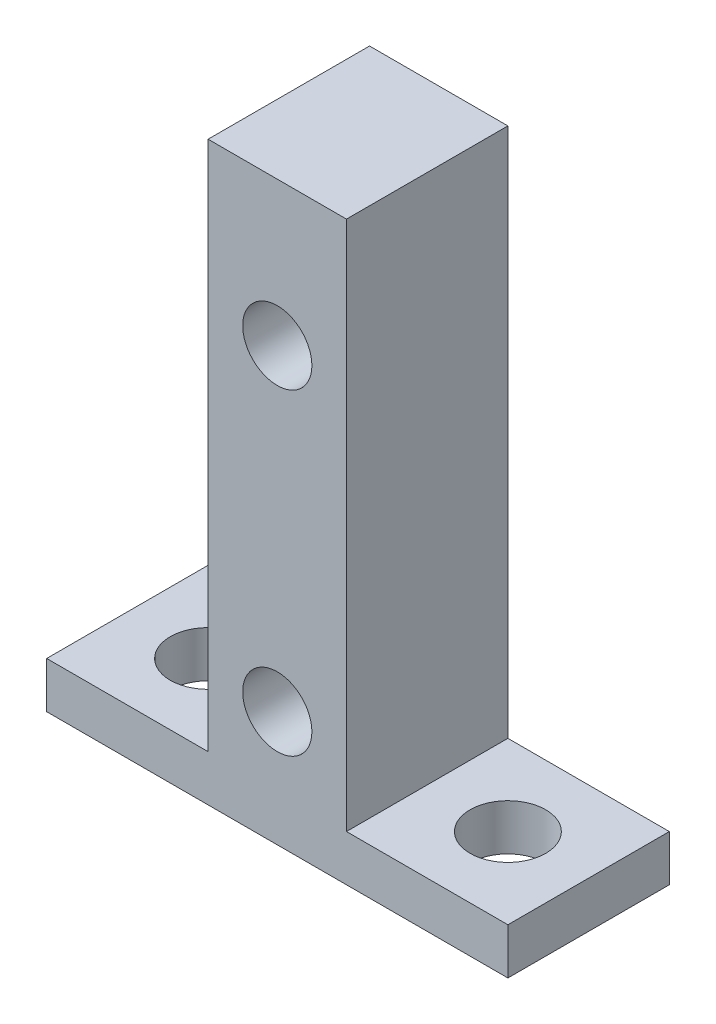
ISO-10303-21;
HEADER;
FILE_DESCRIPTION(('STEP AP214'),'2;1');
FILE_NAME('part.step','',(''),(''),'','','');
FILE_SCHEMA(('AUTOMOTIVE_DESIGN { 1 0 10303 214 1 1 1 1 }'));
ENDSEC;
DATA;
#1=APPLICATION_CONTEXT('core data for automotive mechanical design processes');
#2=APPLICATION_PROTOCOL_DEFINITION('international standard','automotive_design',2000,#1);
#3=PRODUCT_CONTEXT('',#1,'mechanical');
#4=PRODUCT('Part','Part','',(#3));
#5=PRODUCT_RELATED_PRODUCT_CATEGORY('part','',(#4));
#6=PRODUCT_DEFINITION_FORMATION('','',#4);
#7=PRODUCT_DEFINITION_CONTEXT('part definition',#1,'design');
#8=PRODUCT_DEFINITION('design','',#6,#7);
#9=PRODUCT_DEFINITION_SHAPE('','',#8);
#10=(LENGTH_UNIT() NAMED_UNIT(*) SI_UNIT(.MILLI.,.METRE.));
#11=(NAMED_UNIT(*) PLANE_ANGLE_UNIT() SI_UNIT($,.RADIAN.));
#12=(NAMED_UNIT(*) SI_UNIT($,.STERADIAN.) SOLID_ANGLE_UNIT());
#13=UNCERTAINTY_MEASURE_WITH_UNIT(LENGTH_MEASURE(1.E-05),#10,'distance_accuracy_value','');
#14=(GEOMETRIC_REPRESENTATION_CONTEXT(3) GLOBAL_UNCERTAINTY_ASSIGNED_CONTEXT((#13)) GLOBAL_UNIT_ASSIGNED_CONTEXT((#10,
#11,#12)) REPRESENTATION_CONTEXT('',''));
#15=CARTESIAN_POINT('',(0.,0.,0.));
#16=DIRECTION('',(0.,0.,1.));
#17=DIRECTION('',(1.,0.,0.));
#18=AXIS2_PLACEMENT_3D('',#15,#16,#17);
#19=CARTESIAN_POINT('',(-31.035625,3.175,24.765));
#20=DIRECTION('',(0.,1.,0.));
#21=DIRECTION('',(0.,0.,1.));
#22=AXIS2_PLACEMENT_3D('',#19,#20,#21);
#23=PLANE('',#22);
#24=CARTESIAN_POINT('',(9.286875,3.175,20.32));
#25=DIRECTION('',(0.,1.,0.));
#26=DIRECTION('',(0.,0.,1.));
#27=AXIS2_PLACEMENT_3D('',#24,#25,#26);
#28=CIRCLE('',#27,2.0828);
#29=CARTESIAN_POINT('',(9.286875,3.175,22.4028));
#30=VERTEX_POINT('',#29);
#31=EDGE_CURVE('E42',#30,#30,#28,.F.);
#32=ORIENTED_EDGE('',*,*,#31,.F.);
#33=EDGE_LOOP('',(#32));
#34=FACE_BOUND('',#33,.T.);
#35=CARTESIAN_POINT('',(25.7968750000001,3.175,20.32));
#36=DIRECTION('',(0.,1.,0.));
#37=DIRECTION('',(0.,0.,1.));
#38=AXIS2_PLACEMENT_3D('',#35,#36,#37);
#39=CIRCLE('',#38,2.0828);
#40=CARTESIAN_POINT('',(25.7968750000001,3.175,22.4028));
#41=VERTEX_POINT('',#40);
#42=EDGE_CURVE('E158',#41,#41,#39,.F.);
#43=ORIENTED_EDGE('',*,*,#42,.F.);
#44=EDGE_LOOP('',(#43));
#45=FACE_BOUND('',#44,.T.);
#46=DIRECTION('',(1.,0.,0.));
#47=VECTOR('',#46,1.);
#48=CARTESIAN_POINT('',(21.351875,3.175,24.765));
#49=LINE('',#48,#47);
#50=CARTESIAN_POINT('',(4.84187500000001,3.175,24.765));
#51=VERTEX_POINT('',#50);
#52=CARTESIAN_POINT('',(30.241875,3.175,24.765));
#53=VERTEX_POINT('',#52);
#54=EDGE_CURVE('E11',#51,#53,#49,.T.);
#55=ORIENTED_EDGE('',*,*,#54,.F.);
#56=DIRECTION('',(0.,0.,1.));
#57=VECTOR('',#56,1.);
#58=CARTESIAN_POINT('',(4.841875,3.175,24.765));
#59=LINE('',#58,#57);
#60=CARTESIAN_POINT('',(4.841875,3.175,15.875));
#61=VERTEX_POINT('',#60);
#62=EDGE_CURVE('E100',#61,#51,#59,.T.);
#63=ORIENTED_EDGE('',*,*,#62,.F.);
#64=DIRECTION('',(-1.,0.,0.));
#65=VECTOR('',#64,1.);
#66=CARTESIAN_POINT('',(21.351875,3.175,15.875));
#67=LINE('',#66,#65);
#68=CARTESIAN_POINT('',(30.241875,3.175,15.875));
#69=VERTEX_POINT('',#68);
#70=EDGE_CURVE('E136',#69,#61,#67,.T.);
#71=ORIENTED_EDGE('',*,*,#70,.F.);
#72=DIRECTION('',(0.,0.,-1.));
#73=VECTOR('',#72,1.);
#74=CARTESIAN_POINT('',(30.241875,3.175,24.765));
#75=LINE('',#74,#73);
#76=EDGE_CURVE('E110',#53,#69,#75,.T.);
#77=ORIENTED_EDGE('',*,*,#76,.F.);
#78=EDGE_LOOP('',(#55,#63,#71,#77));
#79=FACE_BOUND('',#78,.T.);
#80=ADVANCED_FACE('F35',(#34,#45,#79),#23,.F.);
#81=CARTESIAN_POINT('',(0.,34.925,0.));
#82=DIRECTION('',(0.,1.,0.));
#83=DIRECTION('',(0.,0.,1.));
#84=AXIS2_PLACEMENT_3D('',#81,#82,#83);
#85=PLANE('',#84);
#86=DIRECTION('',(0.,0.,1.));
#87=VECTOR('',#86,1.);
#88=CARTESIAN_POINT('',(13.731875,34.925,24.765));
#89=LINE('',#88,#87);
#90=CARTESIAN_POINT('',(13.731875,34.925,15.875));
#91=VERTEX_POINT('',#90);
#92=CARTESIAN_POINT('',(13.731875,34.925,24.765));
#93=VERTEX_POINT('',#92);
#94=EDGE_CURVE('E137',#91,#93,#89,.T.);
#95=ORIENTED_EDGE('',*,*,#94,.T.);
#96=DIRECTION('',(1.,0.,0.));
#97=VECTOR('',#96,1.);
#98=CARTESIAN_POINT('',(21.351875,34.925,24.765));
#99=LINE('',#98,#97);
#100=CARTESIAN_POINT('',(21.351875,34.925,24.765));
#101=VERTEX_POINT('',#100);
#102=EDGE_CURVE('E140',#93,#101,#99,.T.);
#103=ORIENTED_EDGE('',*,*,#102,.T.);
#104=DIRECTION('',(0.,0.,-1.));
#105=VECTOR('',#104,1.);
#106=CARTESIAN_POINT('',(21.351875,34.925,24.765));
#107=LINE('',#106,#105);
#108=CARTESIAN_POINT('',(21.351875,34.925,15.875));
#109=VERTEX_POINT('',#108);
#110=EDGE_CURVE('E142',#101,#109,#107,.T.);
#111=ORIENTED_EDGE('',*,*,#110,.T.);
#112=DIRECTION('',(-1.,0.,0.));
#113=VECTOR('',#112,1.);
#114=CARTESIAN_POINT('',(21.351875,34.925,15.875));
#115=LINE('',#114,#113);
#116=EDGE_CURVE('E144',#109,#91,#115,.T.);
#117=ORIENTED_EDGE('',*,*,#116,.T.);
#118=EDGE_LOOP('',(#95,#103,#111,#117));
#119=FACE_BOUND('',#118,.T.);
#120=ADVANCED_FACE('F177',(#119),#85,.T.);
#121=CARTESIAN_POINT('',(13.731875,34.925,24.765));
#122=DIRECTION('',(1.,0.,0.));
#123=DIRECTION('',(0.,0.,-1.));
#124=AXIS2_PLACEMENT_3D('',#121,#122,#123);
#125=PLANE('',#124);
#126=DIRECTION('',(0.,-1.,0.));
#127=VECTOR('',#126,1.);
#128=CARTESIAN_POINT('',(13.731875,34.925,15.875));
#129=LINE('',#128,#127);
#130=CARTESIAN_POINT('',(13.731875,5.715,15.875));
#131=VERTEX_POINT('',#130);
#132=EDGE_CURVE('E146',#91,#131,#129,.T.);
#133=ORIENTED_EDGE('',*,*,#132,.T.);
#134=DIRECTION('',(0.,0.,1.));
#135=VECTOR('',#134,1.);
#136=CARTESIAN_POINT('',(13.731875,5.715,24.765));
#137=LINE('',#136,#135);
#138=CARTESIAN_POINT('',(13.731875,5.715,24.765));
#139=VERTEX_POINT('',#138);
#140=EDGE_CURVE('E121',#131,#139,#137,.T.);
#141=ORIENTED_EDGE('',*,*,#140,.T.);
#142=DIRECTION('',(0.,-1.,0.));
#143=VECTOR('',#142,1.);
#144=CARTESIAN_POINT('',(13.731875,34.925,24.765));
#145=LINE('',#144,#143);
#146=EDGE_CURVE('E156',#93,#139,#145,.T.);
#147=ORIENTED_EDGE('',*,*,#146,.F.);
#148=ORIENTED_EDGE('',*,*,#94,.F.);
#149=EDGE_LOOP('',(#133,#141,#147,#148));
#150=FACE_BOUND('',#149,.T.);
#151=ADVANCED_FACE('F209',(#150),#125,.F.);
#152=CARTESIAN_POINT('',(21.351875,34.925,24.765));
#153=DIRECTION('',(-1.,0.,0.));
#154=DIRECTION('',(0.,0.,1.));
#155=AXIS2_PLACEMENT_3D('',#152,#153,#154);
#156=PLANE('',#155);
#157=DIRECTION('',(0.,-1.,0.));
#158=VECTOR('',#157,1.);
#159=CARTESIAN_POINT('',(21.351875,34.925,24.765));
#160=LINE('',#159,#158);
#161=CARTESIAN_POINT('',(21.351875,5.715,24.765));
#162=VERTEX_POINT('',#161);
#163=EDGE_CURVE('E153',#101,#162,#160,.T.);
#164=ORIENTED_EDGE('',*,*,#163,.T.);
#165=DIRECTION('',(0.,0.,-1.));
#166=VECTOR('',#165,1.);
#167=CARTESIAN_POINT('',(21.351875,5.715,24.765));
#168=LINE('',#167,#166);
#169=CARTESIAN_POINT('',(21.351875,5.715,15.875));
#170=VERTEX_POINT('',#169);
#171=EDGE_CURVE('E118',#162,#170,#168,.T.);
#172=ORIENTED_EDGE('',*,*,#171,.T.);
#173=DIRECTION('',(0.,-1.,0.));
#174=VECTOR('',#173,1.);
#175=CARTESIAN_POINT('',(21.351875,34.925,15.875));
#176=LINE('',#175,#174);
#177=EDGE_CURVE('E150',#109,#170,#176,.T.);
#178=ORIENTED_EDGE('',*,*,#177,.F.);
#179=ORIENTED_EDGE('',*,*,#110,.F.);
#180=EDGE_LOOP('',(#164,#172,#178,#179));
#181=FACE_BOUND('',#180,.T.);
#182=ADVANCED_FACE('F202',(#181),#156,.F.);
#183=CARTESIAN_POINT('',(17.541875,26.9875,0.));
#184=DIRECTION('',(0.,0.,1.));
#185=DIRECTION('',(1.,0.,0.));
#186=AXIS2_PLACEMENT_3D('',#183,#184,#185);
#187=CYLINDRICAL_SURFACE('',#186,1.905);
#188=CARTESIAN_POINT('',(17.541875,26.9875,15.875));
#189=DIRECTION('',(0.,0.,1.));
#190=DIRECTION('',(1.,0.,0.));
#191=AXIS2_PLACEMENT_3D('',#188,#189,#190);
#192=CIRCLE('',#191,1.905);
#193=CARTESIAN_POINT('',(19.446875,26.9875,15.875));
#194=VERTEX_POINT('',#193);
#195=EDGE_CURVE('E128',#194,#194,#192,.T.);
#196=CARTESIAN_POINT('',(17.541875,26.9875,24.765));
#197=DIRECTION('',(0.,0.,-1.));
#198=DIRECTION('',(-1.,0.,0.));
#199=AXIS2_PLACEMENT_3D('',#196,#197,#198);
#200=CIRCLE('',#199,1.905);
#201=CARTESIAN_POINT('',(19.446875,26.9875,24.765));
#202=VERTEX_POINT('',#201);
#203=EDGE_CURVE('E129',#202,#202,#200,.T.);
#204=CARTESIAN_POINT('',(19.446875,26.9875,15.875));
#205=CARTESIAN_POINT('',(19.446875,26.9875,15.9676041666667));
#206=CARTESIAN_POINT('',(19.446875,26.9875,16.0602083333333));
#207=CARTESIAN_POINT('',(19.446875,26.9875,16.2454166666667));
#208=CARTESIAN_POINT('',(19.446875,26.9875,16.3380208333333));
#209=CARTESIAN_POINT('',(19.446875,26.9875,16.5232291666667));
#210=CARTESIAN_POINT('',(19.446875,26.9875,16.6158333333333));
#211=CARTESIAN_POINT('',(19.446875,26.9875,16.8010416666667));
#212=CARTESIAN_POINT('',(19.446875,26.9875,16.8936458333333));
#213=CARTESIAN_POINT('',(19.446875,26.9875,17.0788541666667));
#214=CARTESIAN_POINT('',(19.446875,26.9875,17.1714583333333));
#215=CARTESIAN_POINT('',(19.446875,26.9875,17.3566666666667));
#216=CARTESIAN_POINT('',(19.446875,26.9875,17.4492708333333));
#217=CARTESIAN_POINT('',(19.446875,26.9875,17.6344791666667));
#218=CARTESIAN_POINT('',(19.446875,26.9875,17.7270833333333));
#219=CARTESIAN_POINT('',(19.446875,26.9875,17.9122916666667));
#220=CARTESIAN_POINT('',(19.446875,26.9875,18.0048958333333));
#221=CARTESIAN_POINT('',(19.446875,26.9875,18.1901041666667));
#222=CARTESIAN_POINT('',(19.446875,26.9875,18.2827083333333));
#223=CARTESIAN_POINT('',(19.446875,26.9875,18.4679166666667));
#224=CARTESIAN_POINT('',(19.446875,26.9875,18.5605208333333));
#225=CARTESIAN_POINT('',(19.446875,26.9875,18.7457291666667));
#226=CARTESIAN_POINT('',(19.446875,26.9875,18.8383333333333));
#227=CARTESIAN_POINT('',(19.446875,26.9875,19.0235416666667));
#228=CARTESIAN_POINT('',(19.446875,26.9875,19.1161458333333));
#229=CARTESIAN_POINT('',(19.446875,26.9875,19.3013541666667));
#230=CARTESIAN_POINT('',(19.446875,26.9875,19.3939583333333));
#231=CARTESIAN_POINT('',(19.446875,26.9875,19.5791666666667));
#232=CARTESIAN_POINT('',(19.446875,26.9875,19.6717708333333));
#233=CARTESIAN_POINT('',(19.446875,26.9875,19.8569791666667));
#234=CARTESIAN_POINT('',(19.446875,26.9875,19.9495833333333));
#235=CARTESIAN_POINT('',(19.446875,26.9875,20.1347916666667));
#236=CARTESIAN_POINT('',(19.446875,26.9875,20.2273958333333));
#237=CARTESIAN_POINT('',(19.446875,26.9875,20.4126041666667));
#238=CARTESIAN_POINT('',(19.446875,26.9875,20.5052083333333));
#239=CARTESIAN_POINT('',(19.446875,26.9875,20.6904166666667));
#240=CARTESIAN_POINT('',(19.446875,26.9875,20.7830208333333));
#241=CARTESIAN_POINT('',(19.446875,26.9875,20.9682291666667));
#242=CARTESIAN_POINT('',(19.446875,26.9875,21.0608333333333));
#243=CARTESIAN_POINT('',(19.446875,26.9875,21.2460416666667));
#244=CARTESIAN_POINT('',(19.446875,26.9875,21.3386458333333));
#245=CARTESIAN_POINT('',(19.446875,26.9875,21.5238541666667));
#246=CARTESIAN_POINT('',(19.446875,26.9875,21.6164583333333));
#247=CARTESIAN_POINT('',(19.446875,26.9875,21.8016666666667));
#248=CARTESIAN_POINT('',(19.446875,26.9875,21.8942708333333));
#249=CARTESIAN_POINT('',(19.446875,26.9875,22.0794791666667));
#250=CARTESIAN_POINT('',(19.446875,26.9875,22.1720833333333));
#251=CARTESIAN_POINT('',(19.446875,26.9875,22.3572916666667));
#252=CARTESIAN_POINT('',(19.446875,26.9875,22.4498958333333));
#253=CARTESIAN_POINT('',(19.446875,26.9875,22.6351041666667));
#254=CARTESIAN_POINT('',(19.446875,26.9875,22.7277083333333));
#255=CARTESIAN_POINT('',(19.446875,26.9875,22.9129166666667));
#256=CARTESIAN_POINT('',(19.446875,26.9875,23.0055208333333));
#257=CARTESIAN_POINT('',(19.446875,26.9875,23.1907291666667));
#258=CARTESIAN_POINT('',(19.446875,26.9875,23.2833333333333));
#259=CARTESIAN_POINT('',(19.446875,26.9875,23.4685416666667));
#260=CARTESIAN_POINT('',(19.446875,26.9875,23.5611458333333));
#261=CARTESIAN_POINT('',(19.446875,26.9875,23.7463541666667));
#262=CARTESIAN_POINT('',(19.446875,26.9875,23.8389583333333));
#263=CARTESIAN_POINT('',(19.446875,26.9875,24.0241666666667));
#264=CARTESIAN_POINT('',(19.446875,26.9875,24.1167708333333));
#265=CARTESIAN_POINT('',(19.446875,26.9875,24.3019791666667));
#266=CARTESIAN_POINT('',(19.446875,26.9875,24.3945833333333));
#267=CARTESIAN_POINT('',(19.446875,26.9875,24.5797916666667));
#268=CARTESIAN_POINT('',(19.446875,26.9875,24.6723958333333));
#269=CARTESIAN_POINT('',(19.446875,26.9875,24.765));
#270=B_SPLINE_CURVE_WITH_KNOTS('',3,(#204,#205,#206,#207,#208,#209,#210,#211,#212,#213,#214,
#215,#216,#217,#218,#219,#220,#221,#222,#223,#224,#225,#226,#227,#228,#229,#230,#231,#232,#233,
#234,#235,#236,#237,#238,#239,#240,#241,#242,#243,#244,#245,#246,#247,#248,#249,#250,#251,#252,
#253,#254,#255,#256,#257,#258,#259,#260,#261,#262,#263,#264,#265,#266,#267,#268,#269),
.UNSPECIFIED.,.F.,.F.,(4,2,2,2,2,2,2,2,2,2,2,2,2,2,2,2,2,2,2,2,2,2,2,2,2,2,2,2,2,2,2,2,4),(0.,
0.277812499999999,0.555625000000001,0.833437499999999,1.11125,1.3890625,1.666875,1.9446875,
2.2225,2.5003125,2.778125,3.0559375,3.33375,3.6115625,3.889375,4.1671875,4.445,4.7228125,
5.000625,5.2784375,5.55625,5.8340625,6.111875,6.3896875,6.6675,6.94531249999999,7.223125,
7.5009375,7.77874999999999,8.0565625,8.33437499999999,8.61218749999999,8.89),.UNSPECIFIED.);
#271=EDGE_CURVE('BSEAM230',#194,#202,#270,.T.);
#272=ORIENTED_EDGE('',*,*,#195,.F.);
#273=ORIENTED_EDGE('',*,*,#203,.F.);
#274=ORIENTED_EDGE('',*,*,#271,.T.);
#275=ORIENTED_EDGE('',*,*,#271,.F.);
#276=EDGE_LOOP('',(#272,#274,#273,#275));
#277=FACE_BOUND('',#276,.T.);
#278=ADVANCED_FACE('F230',(#277),#187,.F.);
#279=CARTESIAN_POINT('',(17.541875,9.525,0.));
#280=DIRECTION('',(0.,0.,1.));
#281=DIRECTION('',(1.,0.,0.));
#282=AXIS2_PLACEMENT_3D('',#279,#280,#281);
#283=CYLINDRICAL_SURFACE('',#282,1.905);
#284=CARTESIAN_POINT('',(17.541875,9.525,15.875));
#285=DIRECTION('',(0.,0.,1.));
#286=DIRECTION('',(1.,0.,0.));
#287=AXIS2_PLACEMENT_3D('',#284,#285,#286);
#288=CIRCLE('',#287,1.905);
#289=CARTESIAN_POINT('',(19.446875,9.525,15.875));
#290=VERTEX_POINT('',#289);
#291=EDGE_CURVE('E132',#290,#290,#288,.T.);
#292=CARTESIAN_POINT('',(17.541875,9.525,24.765));
#293=DIRECTION('',(0.,0.,-1.));
#294=DIRECTION('',(-1.,0.,0.));
#295=AXIS2_PLACEMENT_3D('',#292,#293,#294);
#296=CIRCLE('',#295,1.905);
#297=CARTESIAN_POINT('',(19.446875,9.525,24.765));
#298=VERTEX_POINT('',#297);
#299=EDGE_CURVE('E133',#298,#298,#296,.T.);
#300=CARTESIAN_POINT('',(19.446875,9.525,15.875));
#301=CARTESIAN_POINT('',(19.446875,9.525,15.9676041666667));
#302=CARTESIAN_POINT('',(19.446875,9.525,16.0602083333333));
#303=CARTESIAN_POINT('',(19.446875,9.525,16.2454166666667));
#304=CARTESIAN_POINT('',(19.446875,9.525,16.3380208333333));
#305=CARTESIAN_POINT('',(19.446875,9.525,16.5232291666667));
#306=CARTESIAN_POINT('',(19.446875,9.525,16.6158333333333));
#307=CARTESIAN_POINT('',(19.446875,9.525,16.8010416666667));
#308=CARTESIAN_POINT('',(19.446875,9.525,16.8936458333333));
#309=CARTESIAN_POINT('',(19.446875,9.525,17.0788541666667));
#310=CARTESIAN_POINT('',(19.446875,9.525,17.1714583333333));
#311=CARTESIAN_POINT('',(19.446875,9.525,17.3566666666667));
#312=CARTESIAN_POINT('',(19.446875,9.525,17.4492708333333));
#313=CARTESIAN_POINT('',(19.446875,9.525,17.6344791666667));
#314=CARTESIAN_POINT('',(19.446875,9.525,17.7270833333333));
#315=CARTESIAN_POINT('',(19.446875,9.525,17.9122916666667));
#316=CARTESIAN_POINT('',(19.446875,9.525,18.0048958333333));
#317=CARTESIAN_POINT('',(19.446875,9.525,18.1901041666667));
#318=CARTESIAN_POINT('',(19.446875,9.525,18.2827083333333));
#319=CARTESIAN_POINT('',(19.446875,9.525,18.4679166666667));
#320=CARTESIAN_POINT('',(19.446875,9.525,18.5605208333333));
#321=CARTESIAN_POINT('',(19.446875,9.525,18.7457291666667));
#322=CARTESIAN_POINT('',(19.446875,9.525,18.8383333333333));
#323=CARTESIAN_POINT('',(19.446875,9.525,19.0235416666667));
#324=CARTESIAN_POINT('',(19.446875,9.525,19.1161458333333));
#325=CARTESIAN_POINT('',(19.446875,9.525,19.3013541666667));
#326=CARTESIAN_POINT('',(19.446875,9.525,19.3939583333333));
#327=CARTESIAN_POINT('',(19.446875,9.525,19.5791666666667));
#328=CARTESIAN_POINT('',(19.446875,9.525,19.6717708333333));
#329=CARTESIAN_POINT('',(19.446875,9.525,19.8569791666667));
#330=CARTESIAN_POINT('',(19.446875,9.525,19.9495833333333));
#331=CARTESIAN_POINT('',(19.446875,9.525,20.1347916666667));
#332=CARTESIAN_POINT('',(19.446875,9.525,20.2273958333333));
#333=CARTESIAN_POINT('',(19.446875,9.525,20.4126041666667));
#334=CARTESIAN_POINT('',(19.446875,9.525,20.5052083333333));
#335=CARTESIAN_POINT('',(19.446875,9.525,20.6904166666667));
#336=CARTESIAN_POINT('',(19.446875,9.525,20.7830208333333));
#337=CARTESIAN_POINT('',(19.446875,9.525,20.9682291666667));
#338=CARTESIAN_POINT('',(19.446875,9.525,21.0608333333333));
#339=CARTESIAN_POINT('',(19.446875,9.525,21.2460416666667));
#340=CARTESIAN_POINT('',(19.446875,9.525,21.3386458333333));
#341=CARTESIAN_POINT('',(19.446875,9.525,21.5238541666667));
#342=CARTESIAN_POINT('',(19.446875,9.525,21.6164583333333));
#343=CARTESIAN_POINT('',(19.446875,9.525,21.8016666666667));
#344=CARTESIAN_POINT('',(19.446875,9.525,21.8942708333333));
#345=CARTESIAN_POINT('',(19.446875,9.525,22.0794791666667));
#346=CARTESIAN_POINT('',(19.446875,9.525,22.1720833333333));
#347=CARTESIAN_POINT('',(19.446875,9.525,22.3572916666667));
#348=CARTESIAN_POINT('',(19.446875,9.525,22.4498958333333));
#349=CARTESIAN_POINT('',(19.446875,9.525,22.6351041666667));
#350=CARTESIAN_POINT('',(19.446875,9.525,22.7277083333333));
#351=CARTESIAN_POINT('',(19.446875,9.525,22.9129166666667));
#352=CARTESIAN_POINT('',(19.446875,9.525,23.0055208333333));
#353=CARTESIAN_POINT('',(19.446875,9.525,23.1907291666667));
#354=CARTESIAN_POINT('',(19.446875,9.525,23.2833333333333));
#355=CARTESIAN_POINT('',(19.446875,9.525,23.4685416666667));
#356=CARTESIAN_POINT('',(19.446875,9.525,23.5611458333333));
#357=CARTESIAN_POINT('',(19.446875,9.525,23.7463541666667));
#358=CARTESIAN_POINT('',(19.446875,9.525,23.8389583333333));
#359=CARTESIAN_POINT('',(19.446875,9.525,24.0241666666667));
#360=CARTESIAN_POINT('',(19.446875,9.525,24.1167708333333));
#361=CARTESIAN_POINT('',(19.446875,9.525,24.3019791666667));
#362=CARTESIAN_POINT('',(19.446875,9.525,24.3945833333333));
#363=CARTESIAN_POINT('',(19.446875,9.525,24.5797916666667));
#364=CARTESIAN_POINT('',(19.446875,9.525,24.6723958333333));
#365=CARTESIAN_POINT('',(19.446875,9.525,24.765));
#366=B_SPLINE_CURVE_WITH_KNOTS('',3,(#300,#301,#302,#303,#304,#305,#306,#307,#308,#309,#310,
#311,#312,#313,#314,#315,#316,#317,#318,#319,#320,#321,#322,#323,#324,#325,#326,#327,#328,#329,
#330,#331,#332,#333,#334,#335,#336,#337,#338,#339,#340,#341,#342,#343,#344,#345,#346,#347,#348,
#349,#350,#351,#352,#353,#354,#355,#356,#357,#358,#359,#360,#361,#362,#363,#364,#365),
.UNSPECIFIED.,.F.,.F.,(4,2,2,2,2,2,2,2,2,2,2,2,2,2,2,2,2,2,2,2,2,2,2,2,2,2,2,2,2,2,2,2,4),(0.,
0.277812499999999,0.555625000000001,0.833437499999999,1.11125,1.3890625,1.666875,1.9446875,
2.2225,2.5003125,2.778125,3.0559375,3.33375,3.6115625,3.889375,4.1671875,4.445,4.7228125,
5.000625,5.2784375,5.55625,5.8340625,6.111875,6.3896875,6.6675,6.94531249999999,7.223125,
7.5009375,7.77874999999999,8.0565625,8.33437499999999,8.61218749999999,8.89),.UNSPECIFIED.);
#367=EDGE_CURVE('BSEAM190',#290,#298,#366,.T.);
#368=ORIENTED_EDGE('',*,*,#291,.F.);
#369=ORIENTED_EDGE('',*,*,#299,.F.);
#370=ORIENTED_EDGE('',*,*,#367,.T.);
#371=ORIENTED_EDGE('',*,*,#367,.F.);
#372=EDGE_LOOP('',(#368,#370,#369,#371));
#373=FACE_BOUND('',#372,.T.);
#374=ADVANCED_FACE('F190',(#373),#283,.F.);
#375=CARTESIAN_POINT('',(0.,5.715,0.));
#376=DIRECTION('',(0.,1.,0.));
#377=DIRECTION('',(0.,0.,1.));
#378=AXIS2_PLACEMENT_3D('',#375,#376,#377);
#379=PLANE('',#378);
#380=CARTESIAN_POINT('',(25.7968750000001,5.715,20.32));
#381=DIRECTION('',(0.,1.,0.));
#382=DIRECTION('',(0.,0.,1.));
#383=AXIS2_PLACEMENT_3D('',#380,#381,#382);
#384=CIRCLE('',#383,2.0828);
#385=CARTESIAN_POINT('',(25.7968750000001,5.715,22.4028));
#386=VERTEX_POINT('',#385);
#387=EDGE_CURVE('E111',#386,#386,#384,.T.);
#388=ORIENTED_EDGE('',*,*,#387,.F.);
#389=EDGE_LOOP('',(#388));
#390=FACE_BOUND('',#389,.T.);
#391=ORIENTED_EDGE('',*,*,#171,.F.);
#392=DIRECTION('',(1.,0.,0.));
#393=VECTOR('',#392,1.);
#394=CARTESIAN_POINT('',(30.241875,5.715,24.765));
#395=LINE('',#394,#393);
#396=CARTESIAN_POINT('',(30.241875,5.715,24.765));
#397=VERTEX_POINT('',#396);
#398=EDGE_CURVE('E194',#162,#397,#395,.T.);
#399=ORIENTED_EDGE('',*,*,#398,.T.);
#400=DIRECTION('',(0.,0.,-1.));
#401=VECTOR('',#400,1.);
#402=CARTESIAN_POINT('',(30.241875,5.715,24.765));
#403=LINE('',#402,#401);
#404=CARTESIAN_POINT('',(30.241875,5.715,15.875));
#405=VERTEX_POINT('',#404);
#406=EDGE_CURVE('E213',#397,#405,#403,.T.);
#407=ORIENTED_EDGE('',*,*,#406,.T.);
#408=DIRECTION('',(-1.,0.,0.));
#409=VECTOR('',#408,1.);
#410=CARTESIAN_POINT('',(30.241875,5.715,15.875));
#411=LINE('',#410,#409);
#412=EDGE_CURVE('E57',#405,#170,#411,.T.);
#413=ORIENTED_EDGE('',*,*,#412,.T.);
#414=EDGE_LOOP('',(#391,#399,#407,#413));
#415=FACE_BOUND('',#414,.T.);
#416=ADVANCED_FACE('F185',(#390,#415),#379,.T.);
#417=CARTESIAN_POINT('',(25.7968750000001,-13.17625,20.32));
#418=DIRECTION('',(0.,1.,0.));
#419=DIRECTION('',(0.,0.,1.));
#420=AXIS2_PLACEMENT_3D('',#417,#418,#419);
#421=CYLINDRICAL_SURFACE('',#420,2.0828);
#422=ORIENTED_EDGE('',*,*,#42,.T.);
#423=EDGE_LOOP('',(#422));
#424=FACE_BOUND('',#423,.T.);
#425=ORIENTED_EDGE('',*,*,#387,.T.);
#426=EDGE_LOOP('',(#425));
#427=FACE_BOUND('',#426,.T.);
#428=ADVANCED_FACE('F181',(#424,#427),#421,.F.);
#429=CARTESIAN_POINT('',(21.351875,34.925,15.875));
#430=DIRECTION('',(0.,0.,1.));
#431=DIRECTION('',(1.,0.,0.));
#432=AXIS2_PLACEMENT_3D('',#429,#430,#431);
#433=PLANE('',#432);
#434=ORIENTED_EDGE('',*,*,#291,.T.);
#435=EDGE_LOOP('',(#434));
#436=FACE_BOUND('',#435,.T.);
#437=ORIENTED_EDGE('',*,*,#195,.T.);
#438=EDGE_LOOP('',(#437));
#439=FACE_BOUND('',#438,.T.);
#440=ORIENTED_EDGE('',*,*,#177,.T.);
#441=ORIENTED_EDGE('',*,*,#412,.F.);
#442=DIRECTION('',(0.,-1.,0.));
#443=VECTOR('',#442,1.);
#444=CARTESIAN_POINT('',(30.241875,5.715,15.875));
#445=LINE('',#444,#443);
#446=EDGE_CURVE('E123',#405,#69,#445,.T.);
#447=ORIENTED_EDGE('',*,*,#446,.T.);
#448=ORIENTED_EDGE('',*,*,#70,.T.);
#449=DIRECTION('',(0.,-1.,0.));
#450=VECTOR('',#449,1.);
#451=CARTESIAN_POINT('',(4.841875,5.715,15.875));
#452=LINE('',#451,#450);
#453=CARTESIAN_POINT('',(4.841875,5.715,15.875));
#454=VERTEX_POINT('',#453);
#455=EDGE_CURVE('E107',#454,#61,#452,.T.);
#456=ORIENTED_EDGE('',*,*,#455,.F.);
#457=EDGE_CURVE('E211',#131,#454,#411,.T.);
#458=ORIENTED_EDGE('',*,*,#457,.F.);
#459=ORIENTED_EDGE('',*,*,#132,.F.);
#460=ORIENTED_EDGE('',*,*,#116,.F.);
#461=EDGE_LOOP('',(#440,#441,#447,#448,#456,#458,#459,#460));
#462=FACE_BOUND('',#461,.T.);
#463=ADVANCED_FACE('F184',(#436,#439,#462),#433,.F.);
#464=CARTESIAN_POINT('',(9.286875,5.715,20.32));
#465=DIRECTION('',(0.,1.,0.));
#466=DIRECTION('',(0.,0.,1.));
#467=AXIS2_PLACEMENT_3D('',#464,#465,#466);
#468=CIRCLE('',#467,2.0828);
#469=CARTESIAN_POINT('',(9.286875,5.715,22.4028));
#470=VERTEX_POINT('',#469);
#471=EDGE_CURVE('E163',#470,#470,#468,.T.);
#472=ORIENTED_EDGE('',*,*,#471,.F.);
#473=EDGE_LOOP('',(#472));
#474=FACE_BOUND('',#473,.T.);
#475=ORIENTED_EDGE('',*,*,#140,.F.);
#476=ORIENTED_EDGE('',*,*,#457,.T.);
#477=DIRECTION('',(0.,0.,1.));
#478=VECTOR('',#477,1.);
#479=CARTESIAN_POINT('',(4.841875,5.715,24.765));
#480=LINE('',#479,#478);
#481=CARTESIAN_POINT('',(4.841875,5.715,24.765));
#482=VERTEX_POINT('',#481);
#483=EDGE_CURVE('E200',#454,#482,#480,.T.);
#484=ORIENTED_EDGE('',*,*,#483,.T.);
#485=EDGE_CURVE('E49',#482,#139,#395,.T.);
#486=ORIENTED_EDGE('',*,*,#485,.T.);
#487=EDGE_LOOP('',(#475,#476,#484,#486));
#488=FACE_BOUND('',#487,.T.);
#489=ADVANCED_FACE('F192',(#474,#488),#379,.T.);
#490=CARTESIAN_POINT('',(9.286875,-13.17625,20.32));
#491=DIRECTION('',(0.,1.,0.));
#492=DIRECTION('',(0.,0.,1.));
#493=AXIS2_PLACEMENT_3D('',#490,#491,#492);
#494=CYLINDRICAL_SURFACE('',#493,2.0828);
#495=ORIENTED_EDGE('',*,*,#31,.T.);
#496=EDGE_LOOP('',(#495));
#497=FACE_BOUND('',#496,.T.);
#498=ORIENTED_EDGE('',*,*,#471,.T.);
#499=EDGE_LOOP('',(#498));
#500=FACE_BOUND('',#499,.T.);
#501=ADVANCED_FACE('F172',(#497,#500),#494,.F.);
#502=CARTESIAN_POINT('',(21.351875,34.925,24.765));
#503=DIRECTION('',(0.,0.,-1.));
#504=DIRECTION('',(-1.,0.,0.));
#505=AXIS2_PLACEMENT_3D('',#502,#503,#504);
#506=PLANE('',#505);
#507=ORIENTED_EDGE('',*,*,#299,.T.);
#508=EDGE_LOOP('',(#507));
#509=FACE_BOUND('',#508,.T.);
#510=ORIENTED_EDGE('',*,*,#203,.T.);
#511=EDGE_LOOP('',(#510));
#512=FACE_BOUND('',#511,.T.);
#513=DIRECTION('',(0.,-1.,0.));
#514=VECTOR('',#513,1.);
#515=CARTESIAN_POINT('',(4.841875,5.715,24.765));
#516=LINE('',#515,#514);
#517=EDGE_CURVE('E105',#482,#51,#516,.T.);
#518=ORIENTED_EDGE('',*,*,#517,.T.);
#519=ORIENTED_EDGE('',*,*,#54,.T.);
#520=DIRECTION('',(0.,-1.,0.));
#521=VECTOR('',#520,1.);
#522=CARTESIAN_POINT('',(30.241875,5.715,24.765));
#523=LINE('',#522,#521);
#524=EDGE_CURVE('E119',#397,#53,#523,.T.);
#525=ORIENTED_EDGE('',*,*,#524,.F.);
#526=ORIENTED_EDGE('',*,*,#398,.F.);
#527=ORIENTED_EDGE('',*,*,#163,.F.);
#528=ORIENTED_EDGE('',*,*,#102,.F.);
#529=ORIENTED_EDGE('',*,*,#146,.T.);
#530=ORIENTED_EDGE('',*,*,#485,.F.);
#531=EDGE_LOOP('',(#518,#519,#525,#526,#527,#528,#529,#530));
#532=FACE_BOUND('',#531,.T.);
#533=ADVANCED_FACE('F116',(#509,#512,#532),#506,.F.);
#534=CARTESIAN_POINT('',(4.841875,5.715,24.765));
#535=DIRECTION('',(1.,0.,0.));
#536=DIRECTION('',(0.,0.,-1.));
#537=AXIS2_PLACEMENT_3D('',#534,#535,#536);
#538=PLANE('',#537);
#539=ORIENTED_EDGE('',*,*,#62,.T.);
#540=ORIENTED_EDGE('',*,*,#517,.F.);
#541=ORIENTED_EDGE('',*,*,#483,.F.);
#542=ORIENTED_EDGE('',*,*,#455,.T.);
#543=EDGE_LOOP('',(#539,#540,#541,#542));
#544=FACE_BOUND('',#543,.T.);
#545=ADVANCED_FACE('F102',(#544),#538,.F.);
#546=CARTESIAN_POINT('',(30.241875,5.715,24.765));
#547=DIRECTION('',(-1.,0.,0.));
#548=DIRECTION('',(0.,0.,1.));
#549=AXIS2_PLACEMENT_3D('',#546,#547,#548);
#550=PLANE('',#549);
#551=ORIENTED_EDGE('',*,*,#76,.T.);
#552=ORIENTED_EDGE('',*,*,#446,.F.);
#553=ORIENTED_EDGE('',*,*,#406,.F.);
#554=ORIENTED_EDGE('',*,*,#524,.T.);
#555=EDGE_LOOP('',(#551,#552,#553,#554));
#556=FACE_BOUND('',#555,.T.);
#557=ADVANCED_FACE('F178',(#556),#550,.F.);
#558=CLOSED_SHELL('',(#80,#120,#151,#182,#278,#374,#416,#428,#463,#489,#501,#533,#545,#557));
#559=MANIFOLD_SOLID_BREP('B2',#558);
#560=ADVANCED_BREP_SHAPE_REPRESENTATION('',(#18,#559),#14);
#561=SHAPE_DEFINITION_REPRESENTATION(#9,#560);
ENDSEC;
END-ISO-10303-21;
